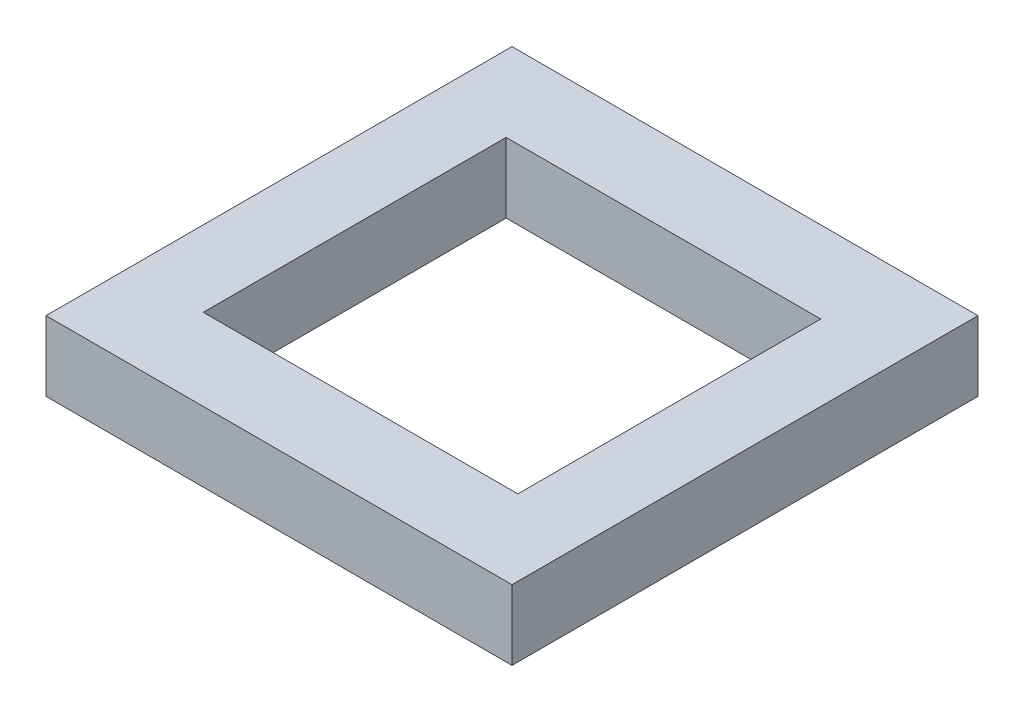
ISO-10303-21;
HEADER;
FILE_DESCRIPTION(('STEP AP214'),'2;1');
FILE_NAME('part.step','',(''),(''),'','','');
FILE_SCHEMA(('AUTOMOTIVE_DESIGN { 1 0 10303 214 1 1 1 1 }'));
ENDSEC;
DATA;
#1=APPLICATION_CONTEXT('core data for automotive mechanical design processes');
#2=APPLICATION_PROTOCOL_DEFINITION('international standard','automotive_design',2000,#1);
#3=PRODUCT_CONTEXT('',#1,'mechanical');
#4=PRODUCT('Part','Part','',(#3));
#5=PRODUCT_RELATED_PRODUCT_CATEGORY('part','',(#4));
#6=PRODUCT_DEFINITION_FORMATION('','',#4);
#7=PRODUCT_DEFINITION_CONTEXT('part definition',#1,'design');
#8=PRODUCT_DEFINITION('design','',#6,#7);
#9=PRODUCT_DEFINITION_SHAPE('','',#8);
#10=(LENGTH_UNIT() NAMED_UNIT(*) SI_UNIT(.MILLI.,.METRE.));
#11=(NAMED_UNIT(*) PLANE_ANGLE_UNIT() SI_UNIT($,.RADIAN.));
#12=(NAMED_UNIT(*) SI_UNIT($,.STERADIAN.) SOLID_ANGLE_UNIT());
#13=UNCERTAINTY_MEASURE_WITH_UNIT(LENGTH_MEASURE(1.E-05),#10,'distance_accuracy_value','');
#14=(GEOMETRIC_REPRESENTATION_CONTEXT(3) GLOBAL_UNCERTAINTY_ASSIGNED_CONTEXT((#13)) GLOBAL_UNIT_ASSIGNED_CONTEXT((#10,
#11,#12)) REPRESENTATION_CONTEXT('',''));
#15=CARTESIAN_POINT('',(0.,0.,0.));
#16=DIRECTION('',(0.,0.,1.));
#17=DIRECTION('',(1.,0.,0.));
#18=AXIS2_PLACEMENT_3D('',#15,#16,#17);
#19=CARTESIAN_POINT('',(0.,6.,0.));
#20=DIRECTION('',(0.,1.,0.));
#21=DIRECTION('',(0.,0.,1.));
#22=AXIS2_PLACEMENT_3D('',#19,#20,#21);
#23=PLANE('',#22);
#24=DIRECTION('',(0.,0.,-1.));
#25=VECTOR('',#24,1.);
#26=CARTESIAN_POINT('',(20.,6.,-20.));
#27=LINE('',#26,#25);
#28=CARTESIAN_POINT('',(20.,6.,20.));
#29=VERTEX_POINT('',#28);
#30=CARTESIAN_POINT('',(20.,6.,-20.));
#31=VERTEX_POINT('',#30);
#32=EDGE_CURVE('E153',#29,#31,#27,.T.);
#33=ORIENTED_EDGE('',*,*,#32,.T.);
#34=DIRECTION('',(-1.,0.,0.));
#35=VECTOR('',#34,1.);
#36=CARTESIAN_POINT('',(-20.,6.,-20.));
#37=LINE('',#36,#35);
#38=CARTESIAN_POINT('',(-20.,6.,-20.));
#39=VERTEX_POINT('',#38);
#40=EDGE_CURVE('E157',#31,#39,#37,.T.);
#41=ORIENTED_EDGE('',*,*,#40,.T.);
#42=DIRECTION('',(0.,0.,1.));
#43=VECTOR('',#42,1.);
#44=CARTESIAN_POINT('',(-20.,6.,-20.));
#45=LINE('',#44,#43);
#46=CARTESIAN_POINT('',(-20.,6.,20.));
#47=VERTEX_POINT('',#46);
#48=EDGE_CURVE('E161',#39,#47,#45,.T.);
#49=ORIENTED_EDGE('',*,*,#48,.T.);
#50=DIRECTION('',(1.,0.,0.));
#51=VECTOR('',#50,1.);
#52=CARTESIAN_POINT('',(-20.,6.,20.));
#53=LINE('',#52,#51);
#54=EDGE_CURVE('E164',#47,#29,#53,.T.);
#55=ORIENTED_EDGE('',*,*,#54,.T.);
#56=EDGE_LOOP('',(#33,#41,#49,#55));
#57=FACE_BOUND('',#56,.T.);
#58=DIRECTION('',(-1.,0.,0.));
#59=VECTOR('',#58,1.);
#60=CARTESIAN_POINT('',(-13.5,6.,-13.));
#61=LINE('',#60,#59);
#62=CARTESIAN_POINT('',(13.5,6.,-13.));
#63=VERTEX_POINT('',#62);
#64=CARTESIAN_POINT('',(-13.5,6.,-13.));
#65=VERTEX_POINT('',#64);
#66=EDGE_CURVE('E114',#63,#65,#61,.T.);
#67=ORIENTED_EDGE('',*,*,#66,.F.);
#68=DIRECTION('',(0.,0.,-1.));
#69=VECTOR('',#68,1.);
#70=CARTESIAN_POINT('',(13.5,6.,-13.));
#71=LINE('',#70,#69);
#72=CARTESIAN_POINT('',(13.5,6.,13.));
#73=VERTEX_POINT('',#72);
#74=EDGE_CURVE('E105',#73,#63,#71,.T.);
#75=ORIENTED_EDGE('',*,*,#74,.F.);
#76=DIRECTION('',(1.,0.,0.));
#77=VECTOR('',#76,1.);
#78=CARTESIAN_POINT('',(-13.5,6.,13.));
#79=LINE('',#78,#77);
#80=CARTESIAN_POINT('',(-13.5,6.,13.));
#81=VERTEX_POINT('',#80);
#82=EDGE_CURVE('E131',#81,#73,#79,.T.);
#83=ORIENTED_EDGE('',*,*,#82,.F.);
#84=DIRECTION('',(0.,0.,1.));
#85=VECTOR('',#84,1.);
#86=CARTESIAN_POINT('',(-13.5,6.,-13.));
#87=LINE('',#86,#85);
#88=EDGE_CURVE('E127',#65,#81,#87,.T.);
#89=ORIENTED_EDGE('',*,*,#88,.F.);
#90=EDGE_LOOP('',(#67,#75,#83,#89));
#91=FACE_BOUND('',#90,.T.);
#92=ADVANCED_FACE('F39',(#57,#91),#23,.T.);
#93=CARTESIAN_POINT('',(0.,0.,0.));
#94=DIRECTION('',(0.,1.,0.));
#95=DIRECTION('',(0.,0.,1.));
#96=AXIS2_PLACEMENT_3D('',#93,#94,#95);
#97=PLANE('',#96);
#98=DIRECTION('',(0.,0.,-1.));
#99=VECTOR('',#98,1.);
#100=CARTESIAN_POINT('',(20.,0.,-20.));
#101=LINE('',#100,#99);
#102=CARTESIAN_POINT('',(20.,0.,20.));
#103=VERTEX_POINT('',#102);
#104=CARTESIAN_POINT('',(20.,0.,-20.));
#105=VERTEX_POINT('',#104);
#106=EDGE_CURVE('E123',#103,#105,#101,.T.);
#107=ORIENTED_EDGE('',*,*,#106,.F.);
#108=DIRECTION('',(1.,0.,0.));
#109=VECTOR('',#108,1.);
#110=CARTESIAN_POINT('',(-20.,0.,20.));
#111=LINE('',#110,#109);
#112=CARTESIAN_POINT('',(-20.,0.,20.));
#113=VERTEX_POINT('',#112);
#114=EDGE_CURVE('E158',#113,#103,#111,.T.);
#115=ORIENTED_EDGE('',*,*,#114,.F.);
#116=DIRECTION('',(0.,0.,1.));
#117=VECTOR('',#116,1.);
#118=CARTESIAN_POINT('',(-20.,0.,-20.));
#119=LINE('',#118,#117);
#120=CARTESIAN_POINT('',(-20.,0.,-20.));
#121=VERTEX_POINT('',#120);
#122=EDGE_CURVE('E174',#121,#113,#119,.T.);
#123=ORIENTED_EDGE('',*,*,#122,.F.);
#124=DIRECTION('',(-1.,0.,0.));
#125=VECTOR('',#124,1.);
#126=CARTESIAN_POINT('',(-20.,0.,-20.));
#127=LINE('',#126,#125);
#128=EDGE_CURVE('E171',#105,#121,#127,.T.);
#129=ORIENTED_EDGE('',*,*,#128,.F.);
#130=EDGE_LOOP('',(#107,#115,#123,#129));
#131=FACE_BOUND('',#130,.T.);
#132=DIRECTION('',(0.,0.,-1.));
#133=VECTOR('',#132,1.);
#134=CARTESIAN_POINT('',(13.5,0.,-13.));
#135=LINE('',#134,#133);
#136=CARTESIAN_POINT('',(13.5,0.,13.));
#137=VERTEX_POINT('',#136);
#138=CARTESIAN_POINT('',(13.5,0.,-13.));
#139=VERTEX_POINT('',#138);
#140=EDGE_CURVE('E63',#137,#139,#135,.T.);
#141=ORIENTED_EDGE('',*,*,#140,.T.);
#142=DIRECTION('',(-1.,0.,0.));
#143=VECTOR('',#142,1.);
#144=CARTESIAN_POINT('',(-13.5,0.,-13.));
#145=LINE('',#144,#143);
#146=CARTESIAN_POINT('',(-13.5,0.,-13.));
#147=VERTEX_POINT('',#146);
#148=EDGE_CURVE('E121',#139,#147,#145,.T.);
#149=ORIENTED_EDGE('',*,*,#148,.T.);
#150=DIRECTION('',(0.,0.,1.));
#151=VECTOR('',#150,1.);
#152=CARTESIAN_POINT('',(-13.5,0.,-13.));
#153=LINE('',#152,#151);
#154=CARTESIAN_POINT('',(-13.5,0.,13.));
#155=VERTEX_POINT('',#154);
#156=EDGE_CURVE('E140',#147,#155,#153,.T.);
#157=ORIENTED_EDGE('',*,*,#156,.T.);
#158=DIRECTION('',(1.,0.,0.));
#159=VECTOR('',#158,1.);
#160=CARTESIAN_POINT('',(-13.5,0.,13.));
#161=LINE('',#160,#159);
#162=EDGE_CURVE('E115',#155,#137,#161,.T.);
#163=ORIENTED_EDGE('',*,*,#162,.T.);
#164=EDGE_LOOP('',(#141,#149,#157,#163));
#165=FACE_BOUND('',#164,.T.);
#166=ADVANCED_FACE('F197',(#131,#165),#97,.F.);
#167=CARTESIAN_POINT('',(20.,6.,-20.));
#168=DIRECTION('',(-1.,0.,0.));
#169=DIRECTION('',(0.,0.,1.));
#170=AXIS2_PLACEMENT_3D('',#167,#168,#169);
#171=PLANE('',#170);
#172=ORIENTED_EDGE('',*,*,#106,.T.);
#173=DIRECTION('',(0.,-1.,0.));
#174=VECTOR('',#173,1.);
#175=CARTESIAN_POINT('',(20.,6.,-20.));
#176=LINE('',#175,#174);
#177=EDGE_CURVE('E11',#31,#105,#176,.T.);
#178=ORIENTED_EDGE('',*,*,#177,.F.);
#179=ORIENTED_EDGE('',*,*,#32,.F.);
#180=DIRECTION('',(0.,-1.,0.));
#181=VECTOR('',#180,1.);
#182=CARTESIAN_POINT('',(20.,6.,20.));
#183=LINE('',#182,#181);
#184=EDGE_CURVE('E167',#29,#103,#183,.T.);
#185=ORIENTED_EDGE('',*,*,#184,.T.);
#186=EDGE_LOOP('',(#172,#178,#179,#185));
#187=FACE_BOUND('',#186,.T.);
#188=ADVANCED_FACE('F41',(#187),#171,.F.);
#189=CARTESIAN_POINT('',(-20.,6.,-20.));
#190=DIRECTION('',(0.,0.,1.));
#191=DIRECTION('',(1.,0.,0.));
#192=AXIS2_PLACEMENT_3D('',#189,#190,#191);
#193=PLANE('',#192);
#194=ORIENTED_EDGE('',*,*,#128,.T.);
#195=DIRECTION('',(0.,-1.,0.));
#196=VECTOR('',#195,1.);
#197=CARTESIAN_POINT('',(-20.,6.,-20.));
#198=LINE('',#197,#196);
#199=EDGE_CURVE('E48',#39,#121,#198,.T.);
#200=ORIENTED_EDGE('',*,*,#199,.F.);
#201=ORIENTED_EDGE('',*,*,#40,.F.);
#202=ORIENTED_EDGE('',*,*,#177,.T.);
#203=EDGE_LOOP('',(#194,#200,#201,#202));
#204=FACE_BOUND('',#203,.T.);
#205=ADVANCED_FACE('F207',(#204),#193,.F.);
#206=CARTESIAN_POINT('',(-20.,6.,-20.));
#207=DIRECTION('',(1.,0.,0.));
#208=DIRECTION('',(0.,0.,-1.));
#209=AXIS2_PLACEMENT_3D('',#206,#207,#208);
#210=PLANE('',#209);
#211=ORIENTED_EDGE('',*,*,#122,.T.);
#212=DIRECTION('',(0.,-1.,0.));
#213=VECTOR('',#212,1.);
#214=CARTESIAN_POINT('',(-20.,6.,20.));
#215=LINE('',#214,#213);
#216=EDGE_CURVE('E182',#47,#113,#215,.T.);
#217=ORIENTED_EDGE('',*,*,#216,.F.);
#218=ORIENTED_EDGE('',*,*,#48,.F.);
#219=ORIENTED_EDGE('',*,*,#199,.T.);
#220=EDGE_LOOP('',(#211,#217,#218,#219));
#221=FACE_BOUND('',#220,.T.);
#222=ADVANCED_FACE('F191',(#221),#210,.F.);
#223=CARTESIAN_POINT('',(-20.,6.,20.));
#224=DIRECTION('',(0.,0.,-1.));
#225=DIRECTION('',(-1.,0.,0.));
#226=AXIS2_PLACEMENT_3D('',#223,#224,#225);
#227=PLANE('',#226);
#228=ORIENTED_EDGE('',*,*,#114,.T.);
#229=ORIENTED_EDGE('',*,*,#184,.F.);
#230=ORIENTED_EDGE('',*,*,#54,.F.);
#231=ORIENTED_EDGE('',*,*,#216,.T.);
#232=EDGE_LOOP('',(#228,#229,#230,#231));
#233=FACE_BOUND('',#232,.T.);
#234=ADVANCED_FACE('F201',(#233),#227,.F.);
#235=CARTESIAN_POINT('',(13.5,6.,-13.));
#236=DIRECTION('',(-1.,0.,0.));
#237=DIRECTION('',(0.,0.,1.));
#238=AXIS2_PLACEMENT_3D('',#235,#236,#237);
#239=PLANE('',#238);
#240=ORIENTED_EDGE('',*,*,#140,.F.);
#241=DIRECTION('',(0.,-1.,0.));
#242=VECTOR('',#241,1.);
#243=CARTESIAN_POINT('',(13.5,6.,13.));
#244=LINE('',#243,#242);
#245=EDGE_CURVE('E109',#73,#137,#244,.T.);
#246=ORIENTED_EDGE('',*,*,#245,.F.);
#247=ORIENTED_EDGE('',*,*,#74,.T.);
#248=DIRECTION('',(0.,-1.,0.));
#249=VECTOR('',#248,1.);
#250=CARTESIAN_POINT('',(13.5,6.,-13.));
#251=LINE('',#250,#249);
#252=EDGE_CURVE('E108',#63,#139,#251,.T.);
#253=ORIENTED_EDGE('',*,*,#252,.T.);
#254=EDGE_LOOP('',(#240,#246,#247,#253));
#255=FACE_BOUND('',#254,.T.);
#256=ADVANCED_FACE('F107',(#255),#239,.T.);
#257=CARTESIAN_POINT('',(-13.5,6.,-13.));
#258=DIRECTION('',(0.,0.,1.));
#259=DIRECTION('',(1.,0.,0.));
#260=AXIS2_PLACEMENT_3D('',#257,#258,#259);
#261=PLANE('',#260);
#262=ORIENTED_EDGE('',*,*,#148,.F.);
#263=ORIENTED_EDGE('',*,*,#252,.F.);
#264=ORIENTED_EDGE('',*,*,#66,.T.);
#265=DIRECTION('',(0.,-1.,0.));
#266=VECTOR('',#265,1.);
#267=CARTESIAN_POINT('',(-13.5,6.,-13.));
#268=LINE('',#267,#266);
#269=EDGE_CURVE('E124',#65,#147,#268,.T.);
#270=ORIENTED_EDGE('',*,*,#269,.T.);
#271=EDGE_LOOP('',(#262,#263,#264,#270));
#272=FACE_BOUND('',#271,.T.);
#273=ADVANCED_FACE('F118',(#272),#261,.T.);
#274=CARTESIAN_POINT('',(-13.5,6.,-13.));
#275=DIRECTION('',(1.,0.,0.));
#276=DIRECTION('',(0.,0.,-1.));
#277=AXIS2_PLACEMENT_3D('',#274,#275,#276);
#278=PLANE('',#277);
#279=ORIENTED_EDGE('',*,*,#156,.F.);
#280=ORIENTED_EDGE('',*,*,#269,.F.);
#281=ORIENTED_EDGE('',*,*,#88,.T.);
#282=DIRECTION('',(0.,-1.,0.));
#283=VECTOR('',#282,1.);
#284=CARTESIAN_POINT('',(-13.5,6.,13.));
#285=LINE('',#284,#283);
#286=EDGE_CURVE('E55',#81,#155,#285,.T.);
#287=ORIENTED_EDGE('',*,*,#286,.T.);
#288=EDGE_LOOP('',(#279,#280,#281,#287));
#289=FACE_BOUND('',#288,.T.);
#290=ADVANCED_FACE('F230',(#289),#278,.T.);
#291=CARTESIAN_POINT('',(-13.5,6.,13.));
#292=DIRECTION('',(0.,0.,-1.));
#293=DIRECTION('',(-1.,0.,0.));
#294=AXIS2_PLACEMENT_3D('',#291,#292,#293);
#295=PLANE('',#294);
#296=ORIENTED_EDGE('',*,*,#162,.F.);
#297=ORIENTED_EDGE('',*,*,#286,.F.);
#298=ORIENTED_EDGE('',*,*,#82,.T.);
#299=ORIENTED_EDGE('',*,*,#245,.T.);
#300=EDGE_LOOP('',(#296,#297,#298,#299));
#301=FACE_BOUND('',#300,.T.);
#302=ADVANCED_FACE('F234',(#301),#295,.T.);
#303=CLOSED_SHELL('',(#92,#166,#188,#205,#222,#234,#256,#273,#290,#302));
#304=MANIFOLD_SOLID_BREP('B2',#303);
#305=ADVANCED_BREP_SHAPE_REPRESENTATION('',(#18,#304),#14);
#306=SHAPE_DEFINITION_REPRESENTATION(#9,#305);
ENDSEC;
END-ISO-10303-21;
